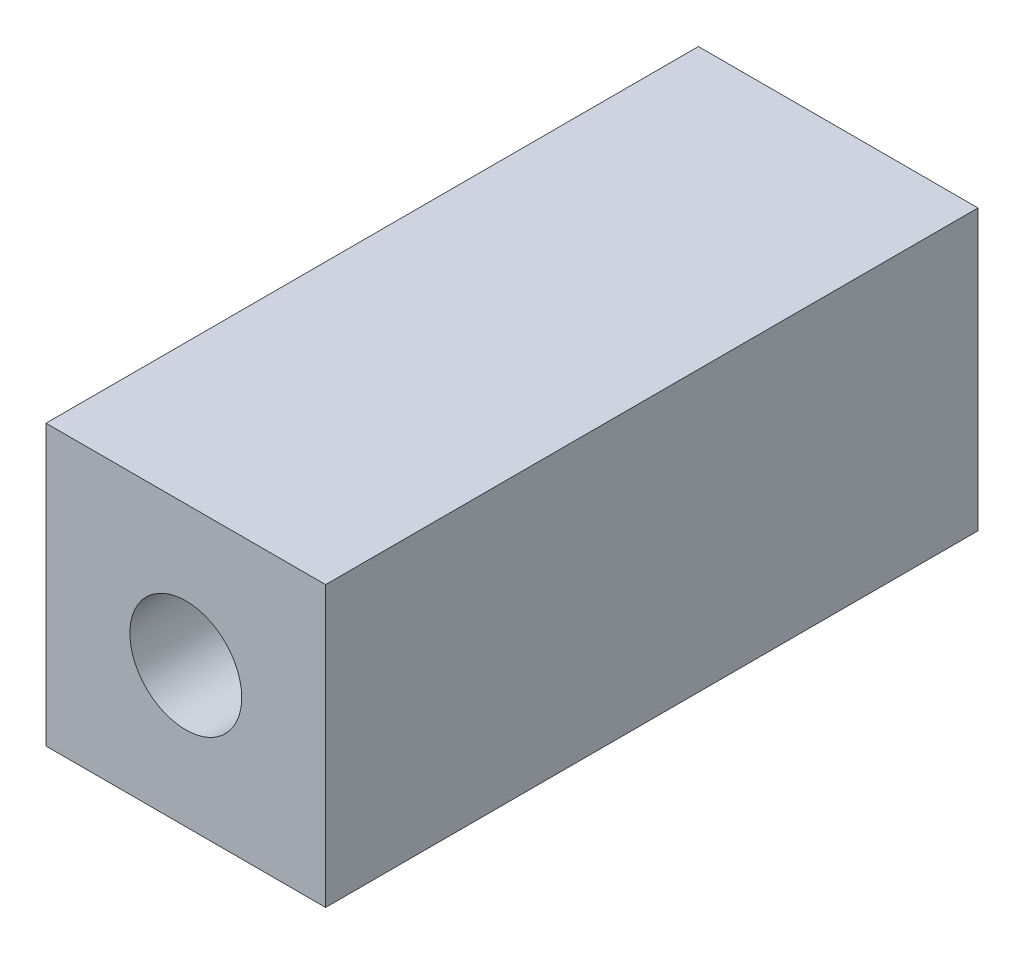
ISO-10303-21;
HEADER;
FILE_DESCRIPTION(('STEP AP214'),'2;1');
FILE_NAME('part.step','',(''),(''),'','','');
FILE_SCHEMA(('AUTOMOTIVE_DESIGN { 1 0 10303 214 1 1 1 1 }'));
ENDSEC;
DATA;
#1=APPLICATION_CONTEXT('core data for automotive mechanical design processes');
#2=APPLICATION_PROTOCOL_DEFINITION('international standard','automotive_design',2000,#1);
#3=PRODUCT_CONTEXT('',#1,'mechanical');
#4=PRODUCT('Part','Part','',(#3));
#5=PRODUCT_RELATED_PRODUCT_CATEGORY('part','',(#4));
#6=PRODUCT_DEFINITION_FORMATION('','',#4);
#7=PRODUCT_DEFINITION_CONTEXT('part definition',#1,'design');
#8=PRODUCT_DEFINITION('design','',#6,#7);
#9=PRODUCT_DEFINITION_SHAPE('','',#8);
#10=(LENGTH_UNIT() NAMED_UNIT(*) SI_UNIT(.MILLI.,.METRE.));
#11=(NAMED_UNIT(*) PLANE_ANGLE_UNIT() SI_UNIT($,.RADIAN.));
#12=(NAMED_UNIT(*) SI_UNIT($,.STERADIAN.) SOLID_ANGLE_UNIT());
#13=UNCERTAINTY_MEASURE_WITH_UNIT(LENGTH_MEASURE(1.E-05),#10,'distance_accuracy_value','');
#14=(GEOMETRIC_REPRESENTATION_CONTEXT(3) GLOBAL_UNCERTAINTY_ASSIGNED_CONTEXT((#13)) GLOBAL_UNIT_ASSIGNED_CONTEXT((#10,
#11,#12)) REPRESENTATION_CONTEXT('',''));
#15=CARTESIAN_POINT('',(0.,0.,0.));
#16=DIRECTION('',(0.,0.,1.));
#17=DIRECTION('',(1.,0.,0.));
#18=AXIS2_PLACEMENT_3D('',#15,#16,#17);
#19=CARTESIAN_POINT('',(15.,-15.,70.));
#20=DIRECTION('',(0.,1.,0.));
#21=DIRECTION('',(0.,0.,1.));
#22=AXIS2_PLACEMENT_3D('',#19,#20,#21);
#23=PLANE('',#22);
#24=DIRECTION('',(1.,0.,0.));
#25=VECTOR('',#24,1.);
#26=CARTESIAN_POINT('',(15.,-15.,0.));
#27=LINE('',#26,#25);
#28=CARTESIAN_POINT('',(-15.,-15.,0.));
#29=VERTEX_POINT('',#28);
#30=CARTESIAN_POINT('',(15.,-15.,0.));
#31=VERTEX_POINT('',#30);
#32=EDGE_CURVE('E86',#29,#31,#27,.T.);
#33=ORIENTED_EDGE('',*,*,#32,.T.);
#34=DIRECTION('',(0.,0.,-1.));
#35=VECTOR('',#34,1.);
#36=CARTESIAN_POINT('',(15.,-15.,70.));
#37=LINE('',#36,#35);
#38=CARTESIAN_POINT('',(15.,-15.,70.));
#39=VERTEX_POINT('',#38);
#40=EDGE_CURVE('E40',#39,#31,#37,.T.);
#41=ORIENTED_EDGE('',*,*,#40,.F.);
#42=DIRECTION('',(1.,0.,0.));
#43=VECTOR('',#42,1.);
#44=CARTESIAN_POINT('',(15.,-15.,70.));
#45=LINE('',#44,#43);
#46=CARTESIAN_POINT('',(-15.,-15.,70.));
#47=VERTEX_POINT('',#46);
#48=EDGE_CURVE('E79',#47,#39,#45,.T.);
#49=ORIENTED_EDGE('',*,*,#48,.F.);
#50=DIRECTION('',(0.,0.,-1.));
#51=VECTOR('',#50,1.);
#52=CARTESIAN_POINT('',(-15.,-15.,70.));
#53=LINE('',#52,#51);
#54=EDGE_CURVE('E11',#47,#29,#53,.T.);
#55=ORIENTED_EDGE('',*,*,#54,.T.);
#56=EDGE_LOOP('',(#33,#41,#49,#55));
#57=FACE_BOUND('',#56,.T.);
#58=ADVANCED_FACE('F32',(#57),#23,.F.);
#59=CARTESIAN_POINT('',(15.,15.,70.));
#60=DIRECTION('',(-1.,0.,0.));
#61=DIRECTION('',(0.,-1.,0.));
#62=AXIS2_PLACEMENT_3D('',#59,#60,#61);
#63=PLANE('',#62);
#64=DIRECTION('',(0.,1.,0.));
#65=VECTOR('',#64,1.);
#66=CARTESIAN_POINT('',(15.,15.,0.));
#67=LINE('',#66,#65);
#68=CARTESIAN_POINT('',(15.,15.,0.));
#69=VERTEX_POINT('',#68);
#70=EDGE_CURVE('E66',#31,#69,#67,.T.);
#71=ORIENTED_EDGE('',*,*,#70,.T.);
#72=DIRECTION('',(0.,0.,-1.));
#73=VECTOR('',#72,1.);
#74=CARTESIAN_POINT('',(15.,15.,70.));
#75=LINE('',#74,#73);
#76=CARTESIAN_POINT('',(15.,15.,70.));
#77=VERTEX_POINT('',#76);
#78=EDGE_CURVE('E87',#77,#69,#75,.T.);
#79=ORIENTED_EDGE('',*,*,#78,.F.);
#80=DIRECTION('',(0.,1.,0.));
#81=VECTOR('',#80,1.);
#82=CARTESIAN_POINT('',(15.,15.,70.));
#83=LINE('',#82,#81);
#84=EDGE_CURVE('E83',#39,#77,#83,.T.);
#85=ORIENTED_EDGE('',*,*,#84,.F.);
#86=ORIENTED_EDGE('',*,*,#40,.T.);
#87=EDGE_LOOP('',(#71,#79,#85,#86));
#88=FACE_BOUND('',#87,.T.);
#89=ADVANCED_FACE('F88',(#88),#63,.F.);
#90=CARTESIAN_POINT('',(-15.,15.,70.));
#91=DIRECTION('',(0.,-1.,0.));
#92=DIRECTION('',(0.,0.,-1.));
#93=AXIS2_PLACEMENT_3D('',#90,#91,#92);
#94=PLANE('',#93);
#95=DIRECTION('',(-1.,0.,0.));
#96=VECTOR('',#95,1.);
#97=CARTESIAN_POINT('',(-15.,15.,0.));
#98=LINE('',#97,#96);
#99=CARTESIAN_POINT('',(-15.,15.,0.));
#100=VERTEX_POINT('',#99);
#101=EDGE_CURVE('E73',#69,#100,#98,.T.);
#102=ORIENTED_EDGE('',*,*,#101,.T.);
#103=DIRECTION('',(0.,0.,-1.));
#104=VECTOR('',#103,1.);
#105=CARTESIAN_POINT('',(-15.,15.,70.));
#106=LINE('',#105,#104);
#107=CARTESIAN_POINT('',(-15.,15.,70.));
#108=VERTEX_POINT('',#107);
#109=EDGE_CURVE('E92',#108,#100,#106,.T.);
#110=ORIENTED_EDGE('',*,*,#109,.F.);
#111=DIRECTION('',(-1.,0.,0.));
#112=VECTOR('',#111,1.);
#113=CARTESIAN_POINT('',(-15.,15.,70.));
#114=LINE('',#113,#112);
#115=EDGE_CURVE('E90',#77,#108,#114,.T.);
#116=ORIENTED_EDGE('',*,*,#115,.F.);
#117=ORIENTED_EDGE('',*,*,#78,.T.);
#118=EDGE_LOOP('',(#102,#110,#116,#117));
#119=FACE_BOUND('',#118,.T.);
#120=ADVANCED_FACE('F103',(#119),#94,.F.);
#121=CARTESIAN_POINT('',(-15.,0.,70.));
#122=DIRECTION('',(1.,0.,0.));
#123=DIRECTION('',(0.,0.,-1.));
#124=AXIS2_PLACEMENT_3D('',#121,#122,#123);
#125=PLANE('',#124);
#126=DIRECTION('',(0.,-1.,0.));
#127=VECTOR('',#126,1.);
#128=CARTESIAN_POINT('',(-15.,0.,0.));
#129=LINE('',#128,#127);
#130=EDGE_CURVE('E100',#100,#29,#129,.T.);
#131=ORIENTED_EDGE('',*,*,#130,.T.);
#132=ORIENTED_EDGE('',*,*,#54,.F.);
#133=DIRECTION('',(0.,-1.,0.));
#134=VECTOR('',#133,1.);
#135=CARTESIAN_POINT('',(-15.,-15.,70.));
#136=LINE('',#135,#134);
#137=EDGE_CURVE('E48',#108,#47,#136,.T.);
#138=ORIENTED_EDGE('',*,*,#137,.F.);
#139=ORIENTED_EDGE('',*,*,#109,.T.);
#140=EDGE_LOOP('',(#131,#132,#138,#139));
#141=FACE_BOUND('',#140,.T.);
#142=ADVANCED_FACE('F107',(#141),#125,.F.);
#143=CARTESIAN_POINT('',(0.,0.,70.));
#144=DIRECTION('',(0.,0.,-1.));
#145=DIRECTION('',(-1.,0.,0.));
#146=AXIS2_PLACEMENT_3D('',#143,#144,#145);
#147=PLANE('',#146);
#148=CARTESIAN_POINT('',(0.,0.,70.));
#149=DIRECTION('',(0.,0.,1.));
#150=DIRECTION('',(1.,0.,0.));
#151=AXIS2_PLACEMENT_3D('',#148,#149,#150);
#152=CIRCLE('',#151,6.);
#153=CARTESIAN_POINT('',(6.,0.,70.));
#154=VERTEX_POINT('',#153);
#155=EDGE_CURVE('E166',#154,#154,#152,.T.);
#156=ORIENTED_EDGE('',*,*,#155,.F.);
#157=EDGE_LOOP('',(#156));
#158=FACE_BOUND('',#157,.T.);
#159=ORIENTED_EDGE('',*,*,#137,.T.);
#160=ORIENTED_EDGE('',*,*,#48,.T.);
#161=ORIENTED_EDGE('',*,*,#84,.T.);
#162=ORIENTED_EDGE('',*,*,#115,.T.);
#163=EDGE_LOOP('',(#159,#160,#161,#162));
#164=FACE_BOUND('',#163,.T.);
#165=ADVANCED_FACE('F81',(#158,#164),#147,.F.);
#166=CARTESIAN_POINT('',(0.,0.,0.));
#167=DIRECTION('',(0.,0.,-1.));
#168=DIRECTION('',(-1.,0.,0.));
#169=AXIS2_PLACEMENT_3D('',#166,#167,#168);
#170=PLANE('',#169);
#171=CARTESIAN_POINT('',(0.,0.,0.));
#172=DIRECTION('',(0.,0.,1.));
#173=DIRECTION('',(1.,0.,0.));
#174=AXIS2_PLACEMENT_3D('',#171,#172,#173);
#175=CIRCLE('',#174,6.);
#176=CARTESIAN_POINT('',(6.,0.,0.));
#177=VERTEX_POINT('',#176);
#178=EDGE_CURVE('E97',#177,#177,#175,.T.);
#179=ORIENTED_EDGE('',*,*,#178,.T.);
#180=EDGE_LOOP('',(#179));
#181=FACE_BOUND('',#180,.T.);
#182=ORIENTED_EDGE('',*,*,#32,.F.);
#183=ORIENTED_EDGE('',*,*,#130,.F.);
#184=ORIENTED_EDGE('',*,*,#101,.F.);
#185=ORIENTED_EDGE('',*,*,#70,.F.);
#186=EDGE_LOOP('',(#182,#183,#184,#185));
#187=FACE_BOUND('',#186,.T.);
#188=ADVANCED_FACE('F106',(#181,#187),#170,.T.);
#189=CARTESIAN_POINT('',(0.,0.,0.));
#190=DIRECTION('',(0.,0.,1.));
#191=DIRECTION('',(1.,0.,0.));
#192=AXIS2_PLACEMENT_3D('',#189,#190,#191);
#193=CYLINDRICAL_SURFACE('',#192,6.);
#194=ORIENTED_EDGE('',*,*,#178,.F.);
#195=EDGE_LOOP('',(#194));
#196=FACE_BOUND('',#195,.T.);
#197=ORIENTED_EDGE('',*,*,#155,.T.);
#198=EDGE_LOOP('',(#197));
#199=FACE_BOUND('',#198,.T.);
#200=ADVANCED_FACE('F148',(#196,#199),#193,.F.);
#201=CLOSED_SHELL('',(#58,#89,#120,#142,#165,#188,#200));
#202=MANIFOLD_SOLID_BREP('B2',#201);
#203=ADVANCED_BREP_SHAPE_REPRESENTATION('',(#18,#202),#14);
#204=SHAPE_DEFINITION_REPRESENTATION(#9,#203);
ENDSEC;
END-ISO-10303-21;
